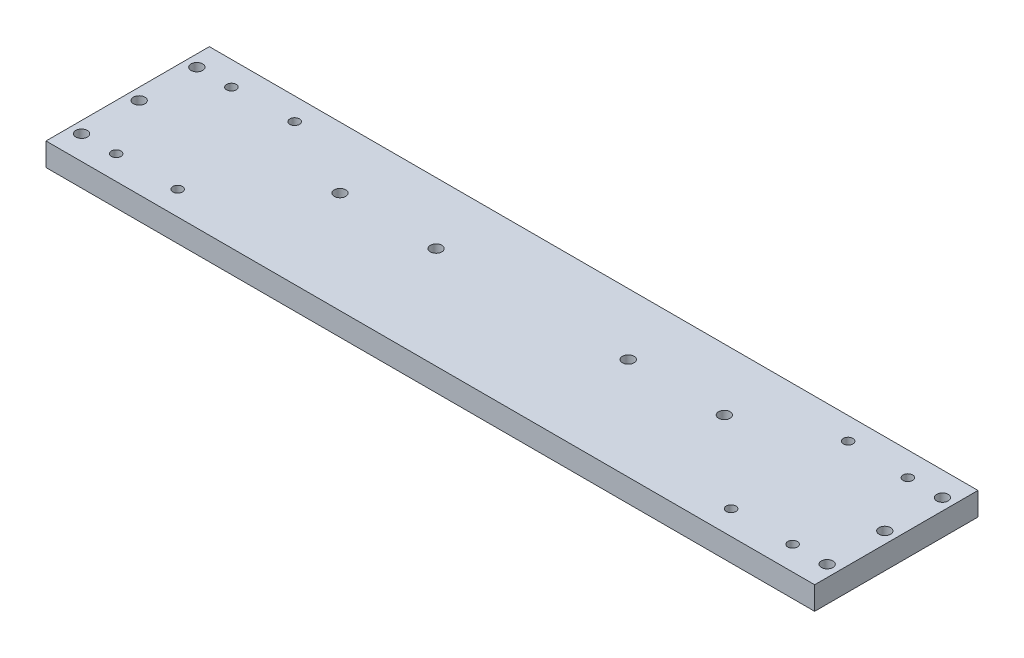
ISO-10303-21;
HEADER;
FILE_DESCRIPTION(('STEP AP214'),'2;1');
FILE_NAME('part.step','',(''),(''),'','','');
FILE_SCHEMA(('AUTOMOTIVE_DESIGN { 1 0 10303 214 1 1 1 1 }'));
ENDSEC;
DATA;
#1=APPLICATION_CONTEXT('core data for automotive mechanical design processes');
#2=APPLICATION_PROTOCOL_DEFINITION('international standard','automotive_design',2000,#1);
#3=PRODUCT_CONTEXT('',#1,'mechanical');
#4=PRODUCT('Part','Part','',(#3));
#5=PRODUCT_RELATED_PRODUCT_CATEGORY('part','',(#4));
#6=PRODUCT_DEFINITION_FORMATION('','',#4);
#7=PRODUCT_DEFINITION_CONTEXT('part definition',#1,'design');
#8=PRODUCT_DEFINITION('design','',#6,#7);
#9=PRODUCT_DEFINITION_SHAPE('','',#8);
#10=(LENGTH_UNIT() NAMED_UNIT(*) SI_UNIT(.MILLI.,.METRE.));
#11=(NAMED_UNIT(*) PLANE_ANGLE_UNIT() SI_UNIT($,.RADIAN.));
#12=(NAMED_UNIT(*) SI_UNIT($,.STERADIAN.) SOLID_ANGLE_UNIT());
#13=UNCERTAINTY_MEASURE_WITH_UNIT(LENGTH_MEASURE(1.E-05),#10,'distance_accuracy_value','');
#14=(GEOMETRIC_REPRESENTATION_CONTEXT(3) GLOBAL_UNCERTAINTY_ASSIGNED_CONTEXT((#13)) GLOBAL_UNIT_ASSIGNED_CONTEXT((#10,
#11,#12)) REPRESENTATION_CONTEXT('',''));
#15=CARTESIAN_POINT('',(0.,0.,0.));
#16=DIRECTION('',(0.,0.,1.));
#17=DIRECTION('',(1.,0.,0.));
#18=AXIS2_PLACEMENT_3D('',#15,#16,#17);
#19=CARTESIAN_POINT('',(200.,12.,-42.5));
#20=DIRECTION('',(0.,-1.,0.));
#21=DIRECTION('',(0.,0.,-1.));
#22=AXIS2_PLACEMENT_3D('',#19,#20,#21);
#23=PLANE('',#22);
#24=CARTESIAN_POINT('',(194.,12.,-30.));
#25=DIRECTION('',(0.,-1.,0.));
#26=DIRECTION('',(0.,0.,1.));
#27=AXIS2_PLACEMENT_3D('',#24,#25,#26);
#28=CIRCLE('',#27,2.99999999999999);
#29=CARTESIAN_POINT('',(194.,12.,-27.));
#30=VERTEX_POINT('',#29);
#31=EDGE_CURVE('E209',#30,#30,#28,.T.);
#32=ORIENTED_EDGE('',*,*,#31,.T.);
#33=EDGE_LOOP('',(#32));
#34=FACE_BOUND('',#33,.T.);
#35=CARTESIAN_POINT('',(176.,12.,-30.));
#36=DIRECTION('',(0.,-1.,0.));
#37=DIRECTION('',(0.,0.,1.));
#38=AXIS2_PLACEMENT_3D('',#35,#36,#37);
#39=CIRCLE('',#38,2.5);
#40=CARTESIAN_POINT('',(176.,12.,-27.5));
#41=VERTEX_POINT('',#40);
#42=EDGE_CURVE('E155',#41,#41,#39,.T.);
#43=ORIENTED_EDGE('',*,*,#42,.T.);
#44=EDGE_LOOP('',(#43));
#45=FACE_BOUND('',#44,.T.);
#46=CARTESIAN_POINT('',(144.,12.,30.));
#47=DIRECTION('',(0.,-1.,0.));
#48=DIRECTION('',(0.,0.,1.));
#49=AXIS2_PLACEMENT_3D('',#46,#47,#48);
#50=CIRCLE('',#49,2.5);
#51=CARTESIAN_POINT('',(144.,12.,32.5));
#52=VERTEX_POINT('',#51);
#53=EDGE_CURVE('E143',#52,#52,#50,.T.);
#54=ORIENTED_EDGE('',*,*,#53,.T.);
#55=EDGE_LOOP('',(#54));
#56=FACE_BOUND('',#55,.T.);
#57=DIRECTION('',(0.,0.,-1.));
#58=VECTOR('',#57,1.);
#59=CARTESIAN_POINT('',(200.,12.,42.5));
#60=LINE('',#59,#58);
#61=CARTESIAN_POINT('',(200.,12.,42.5));
#62=VERTEX_POINT('',#61);
#63=CARTESIAN_POINT('',(200.,12.,-42.5));
#64=VERTEX_POINT('',#63);
#65=EDGE_CURVE('E84',#62,#64,#60,.T.);
#66=ORIENTED_EDGE('',*,*,#65,.T.);
#67=DIRECTION('',(-1.,0.,0.));
#68=VECTOR('',#67,1.);
#69=CARTESIAN_POINT('',(-200.,12.,-42.5));
#70=LINE('',#69,#68);
#71=CARTESIAN_POINT('',(-200.,12.,-42.5));
#72=VERTEX_POINT('',#71);
#73=EDGE_CURVE('E79',#64,#72,#70,.T.);
#74=ORIENTED_EDGE('',*,*,#73,.T.);
#75=DIRECTION('',(0.,0.,1.));
#76=VECTOR('',#75,1.);
#77=CARTESIAN_POINT('',(-200.,12.,42.5));
#78=LINE('',#77,#76);
#79=CARTESIAN_POINT('',(-200.,12.,42.5));
#80=VERTEX_POINT('',#79);
#81=EDGE_CURVE('E82',#72,#80,#78,.T.);
#82=ORIENTED_EDGE('',*,*,#81,.T.);
#83=DIRECTION('',(1.,0.,0.));
#84=VECTOR('',#83,1.);
#85=CARTESIAN_POINT('',(-200.,12.,42.5));
#86=LINE('',#85,#84);
#87=EDGE_CURVE('E49',#80,#62,#86,.T.);
#88=ORIENTED_EDGE('',*,*,#87,.T.);
#89=EDGE_LOOP('',(#66,#74,#82,#88));
#90=FACE_BOUND('',#89,.T.);
#91=CARTESIAN_POINT('',(-176.,12.,30.));
#92=DIRECTION('',(0.,1.,0.));
#93=DIRECTION('',(0.,0.,1.));
#94=AXIS2_PLACEMENT_3D('',#91,#92,#93);
#95=CIRCLE('',#94,2.5);
#96=CARTESIAN_POINT('',(-176.,12.,32.5));
#97=VERTEX_POINT('',#96);
#98=EDGE_CURVE('E99',#97,#97,#95,.T.);
#99=ORIENTED_EDGE('',*,*,#98,.F.);
#100=EDGE_LOOP('',(#99));
#101=FACE_BOUND('',#100,.T.);
#102=CARTESIAN_POINT('',(-144.,12.,30.));
#103=DIRECTION('',(0.,1.,0.));
#104=DIRECTION('',(0.,0.,1.));
#105=AXIS2_PLACEMENT_3D('',#102,#103,#104);
#106=CIRCLE('',#105,2.5);
#107=CARTESIAN_POINT('',(-144.,12.,32.5));
#108=VERTEX_POINT('',#107);
#109=EDGE_CURVE('E114',#108,#108,#106,.T.);
#110=ORIENTED_EDGE('',*,*,#109,.F.);
#111=EDGE_LOOP('',(#110));
#112=FACE_BOUND('',#111,.T.);
#113=CARTESIAN_POINT('',(-144.,12.,-30.918491962409));
#114=DIRECTION('',(0.,1.,0.));
#115=DIRECTION('',(0.,0.,1.));
#116=AXIS2_PLACEMENT_3D('',#113,#114,#115);
#117=CIRCLE('',#116,2.5);
#118=CARTESIAN_POINT('',(-144.,12.,-28.418491962409));
#119=VERTEX_POINT('',#118);
#120=EDGE_CURVE('E120',#119,#119,#117,.T.);
#121=ORIENTED_EDGE('',*,*,#120,.F.);
#122=EDGE_LOOP('',(#121));
#123=FACE_BOUND('',#122,.T.);
#124=CARTESIAN_POINT('',(-176.,12.,-30.));
#125=DIRECTION('',(0.,1.,0.));
#126=DIRECTION('',(0.,0.,1.));
#127=AXIS2_PLACEMENT_3D('',#124,#125,#126);
#128=CIRCLE('',#127,2.5);
#129=CARTESIAN_POINT('',(-176.,12.,-27.5));
#130=VERTEX_POINT('',#129);
#131=EDGE_CURVE('E126',#130,#130,#128,.T.);
#132=ORIENTED_EDGE('',*,*,#131,.F.);
#133=EDGE_LOOP('',(#132));
#134=FACE_BOUND('',#133,.T.);
#135=CARTESIAN_POINT('',(176.,12.,30.));
#136=DIRECTION('',(0.,-1.,0.));
#137=DIRECTION('',(0.,0.,1.));
#138=AXIS2_PLACEMENT_3D('',#135,#136,#137);
#139=CIRCLE('',#138,2.5);
#140=CARTESIAN_POINT('',(176.,12.,32.5));
#141=VERTEX_POINT('',#140);
#142=EDGE_CURVE('E137',#141,#141,#139,.T.);
#143=ORIENTED_EDGE('',*,*,#142,.T.);
#144=EDGE_LOOP('',(#143));
#145=FACE_BOUND('',#144,.T.);
#146=CARTESIAN_POINT('',(144.,12.,-30.918491962409));
#147=DIRECTION('',(0.,-1.,0.));
#148=DIRECTION('',(0.,0.,1.));
#149=AXIS2_PLACEMENT_3D('',#146,#147,#148);
#150=CIRCLE('',#149,2.5);
#151=CARTESIAN_POINT('',(144.,12.,-28.418491962409));
#152=VERTEX_POINT('',#151);
#153=EDGE_CURVE('E149',#152,#152,#150,.T.);
#154=ORIENTED_EDGE('',*,*,#153,.T.);
#155=EDGE_LOOP('',(#154));
#156=FACE_BOUND('',#155,.T.);
#157=CARTESIAN_POINT('',(50.,12.,-10.5));
#158=DIRECTION('',(0.,1.,0.));
#159=DIRECTION('',(0.,0.,1.));
#160=AXIS2_PLACEMENT_3D('',#157,#158,#159);
#161=CIRCLE('',#160,3.);
#162=CARTESIAN_POINT('',(50.,12.,-7.49999999999998));
#163=VERTEX_POINT('',#162);
#164=EDGE_CURVE('E158',#163,#163,#161,.T.);
#165=ORIENTED_EDGE('',*,*,#164,.F.);
#166=EDGE_LOOP('',(#165));
#167=FACE_BOUND('',#166,.T.);
#168=CARTESIAN_POINT('',(100.,12.,-10.5));
#169=DIRECTION('',(0.,1.,0.));
#170=DIRECTION('',(0.,0.,1.));
#171=AXIS2_PLACEMENT_3D('',#168,#169,#170);
#172=CIRCLE('',#171,2.99999999999999);
#173=CARTESIAN_POINT('',(100.,12.,-7.5));
#174=VERTEX_POINT('',#173);
#175=EDGE_CURVE('E162',#174,#174,#172,.T.);
#176=ORIENTED_EDGE('',*,*,#175,.F.);
#177=EDGE_LOOP('',(#176));
#178=FACE_BOUND('',#177,.T.);
#179=CARTESIAN_POINT('',(-100.,12.,-10.5));
#180=DIRECTION('',(0.,1.,0.));
#181=DIRECTION('',(0.,0.,1.));
#182=AXIS2_PLACEMENT_3D('',#179,#180,#181);
#183=CIRCLE('',#182,3.00000000000001);
#184=CARTESIAN_POINT('',(-100.,12.,-7.49999999999996));
#185=VERTEX_POINT('',#184);
#186=EDGE_CURVE('E168',#185,#185,#183,.T.);
#187=ORIENTED_EDGE('',*,*,#186,.F.);
#188=EDGE_LOOP('',(#187));
#189=FACE_BOUND('',#188,.T.);
#190=CARTESIAN_POINT('',(-50.,12.,-10.5));
#191=DIRECTION('',(0.,1.,0.));
#192=DIRECTION('',(0.,0.,1.));
#193=AXIS2_PLACEMENT_3D('',#190,#191,#192);
#194=CIRCLE('',#193,3.);
#195=CARTESIAN_POINT('',(-50.,12.,-7.49999999999997));
#196=VERTEX_POINT('',#195);
#197=EDGE_CURVE('E174',#196,#196,#194,.T.);
#198=ORIENTED_EDGE('',*,*,#197,.F.);
#199=EDGE_LOOP('',(#198));
#200=FACE_BOUND('',#199,.T.);
#201=CARTESIAN_POINT('',(-194.,12.,0.));
#202=DIRECTION('',(0.,1.,0.));
#203=DIRECTION('',(0.,0.,1.));
#204=AXIS2_PLACEMENT_3D('',#201,#202,#203);
#205=CIRCLE('',#204,2.99999999999999);
#206=CARTESIAN_POINT('',(-194.,12.,2.99999999999999));
#207=VERTEX_POINT('',#206);
#208=EDGE_CURVE('E180',#207,#207,#205,.T.);
#209=ORIENTED_EDGE('',*,*,#208,.F.);
#210=EDGE_LOOP('',(#209));
#211=FACE_BOUND('',#210,.T.);
#212=CARTESIAN_POINT('',(-194.,12.,-30.));
#213=DIRECTION('',(0.,1.,0.));
#214=DIRECTION('',(0.,0.,1.));
#215=AXIS2_PLACEMENT_3D('',#212,#213,#214);
#216=CIRCLE('',#215,2.99999999999999);
#217=CARTESIAN_POINT('',(-194.,12.,-27.));
#218=VERTEX_POINT('',#217);
#219=EDGE_CURVE('E186',#218,#218,#216,.T.);
#220=ORIENTED_EDGE('',*,*,#219,.F.);
#221=EDGE_LOOP('',(#220));
#222=FACE_BOUND('',#221,.T.);
#223=CARTESIAN_POINT('',(-194.,12.,30.));
#224=DIRECTION('',(0.,1.,0.));
#225=DIRECTION('',(0.,0.,1.));
#226=AXIS2_PLACEMENT_3D('',#223,#224,#225);
#227=CIRCLE('',#226,2.99999999999999);
#228=CARTESIAN_POINT('',(-194.,12.,33.));
#229=VERTEX_POINT('',#228);
#230=EDGE_CURVE('E192',#229,#229,#227,.T.);
#231=ORIENTED_EDGE('',*,*,#230,.F.);
#232=EDGE_LOOP('',(#231));
#233=FACE_BOUND('',#232,.T.);
#234=CARTESIAN_POINT('',(194.,12.,0.));
#235=DIRECTION('',(0.,-1.,0.));
#236=DIRECTION('',(0.,0.,1.));
#237=AXIS2_PLACEMENT_3D('',#234,#235,#236);
#238=CIRCLE('',#237,2.99999999999999);
#239=CARTESIAN_POINT('',(194.,12.,2.99999999999999));
#240=VERTEX_POINT('',#239);
#241=EDGE_CURVE('E203',#240,#240,#238,.T.);
#242=ORIENTED_EDGE('',*,*,#241,.T.);
#243=EDGE_LOOP('',(#242));
#244=FACE_BOUND('',#243,.T.);
#245=CARTESIAN_POINT('',(194.,12.,30.));
#246=DIRECTION('',(0.,-1.,0.));
#247=DIRECTION('',(0.,0.,1.));
#248=AXIS2_PLACEMENT_3D('',#245,#246,#247);
#249=CIRCLE('',#248,2.99999999999999);
#250=CARTESIAN_POINT('',(194.,12.,33.));
#251=VERTEX_POINT('',#250);
#252=EDGE_CURVE('E215',#251,#251,#249,.T.);
#253=ORIENTED_EDGE('',*,*,#252,.T.);
#254=EDGE_LOOP('',(#253));
#255=FACE_BOUND('',#254,.T.);
#256=ADVANCED_FACE('F32',(#34,#45,#56,#90,#101,#112,#123,#134,#145,#156,#167,#178,#189,#200,
#211,#222,#233,#244,#255),#23,.F.);
#257=CARTESIAN_POINT('',(200.,0.,-42.5));
#258=DIRECTION('',(0.,-1.,0.));
#259=DIRECTION('',(0.,0.,-1.));
#260=AXIS2_PLACEMENT_3D('',#257,#258,#259);
#261=PLANE('',#260);
#262=CARTESIAN_POINT('',(194.,0.,-30.));
#263=DIRECTION('',(0.,-1.,0.));
#264=DIRECTION('',(0.,0.,-1.));
#265=AXIS2_PLACEMENT_3D('',#262,#263,#264);
#266=CIRCLE('',#265,2.99999999999999);
#267=CARTESIAN_POINT('',(194.,0.,-33.));
#268=VERTEX_POINT('',#267);
#269=EDGE_CURVE('E206',#268,#268,#266,.T.);
#270=ORIENTED_EDGE('',*,*,#269,.F.);
#271=EDGE_LOOP('',(#270));
#272=FACE_BOUND('',#271,.T.);
#273=CARTESIAN_POINT('',(176.,0.,-30.));
#274=DIRECTION('',(0.,-1.,0.));
#275=DIRECTION('',(0.,0.,-1.));
#276=AXIS2_PLACEMENT_3D('',#273,#274,#275);
#277=CIRCLE('',#276,2.5);
#278=CARTESIAN_POINT('',(176.,0.,-32.5));
#279=VERTEX_POINT('',#278);
#280=EDGE_CURVE('E152',#279,#279,#277,.T.);
#281=ORIENTED_EDGE('',*,*,#280,.F.);
#282=EDGE_LOOP('',(#281));
#283=FACE_BOUND('',#282,.T.);
#284=CARTESIAN_POINT('',(144.,0.,30.));
#285=DIRECTION('',(0.,-1.,0.));
#286=DIRECTION('',(0.,0.,-1.));
#287=AXIS2_PLACEMENT_3D('',#284,#285,#286);
#288=CIRCLE('',#287,2.5);
#289=CARTESIAN_POINT('',(144.,0.,27.5));
#290=VERTEX_POINT('',#289);
#291=EDGE_CURVE('E140',#290,#290,#288,.T.);
#292=ORIENTED_EDGE('',*,*,#291,.F.);
#293=EDGE_LOOP('',(#292));
#294=FACE_BOUND('',#293,.T.);
#295=DIRECTION('',(0.,0.,-1.));
#296=VECTOR('',#295,1.);
#297=CARTESIAN_POINT('',(200.,0.,42.5));
#298=LINE('',#297,#296);
#299=CARTESIAN_POINT('',(200.,0.,42.5));
#300=VERTEX_POINT('',#299);
#301=CARTESIAN_POINT('',(200.,0.,-42.5));
#302=VERTEX_POINT('',#301);
#303=EDGE_CURVE('E96',#300,#302,#298,.T.);
#304=ORIENTED_EDGE('',*,*,#303,.F.);
#305=DIRECTION('',(1.,0.,0.));
#306=VECTOR('',#305,1.);
#307=CARTESIAN_POINT('',(-200.,0.,42.5));
#308=LINE('',#307,#306);
#309=CARTESIAN_POINT('',(-200.,0.,42.5));
#310=VERTEX_POINT('',#309);
#311=EDGE_CURVE('E72',#310,#300,#308,.T.);
#312=ORIENTED_EDGE('',*,*,#311,.F.);
#313=DIRECTION('',(0.,0.,1.));
#314=VECTOR('',#313,1.);
#315=CARTESIAN_POINT('',(-200.,0.,42.5));
#316=LINE('',#315,#314);
#317=CARTESIAN_POINT('',(-200.,0.,-42.5));
#318=VERTEX_POINT('',#317);
#319=EDGE_CURVE('E66',#318,#310,#316,.T.);
#320=ORIENTED_EDGE('',*,*,#319,.F.);
#321=DIRECTION('',(-1.,0.,0.));
#322=VECTOR('',#321,1.);
#323=CARTESIAN_POINT('',(-200.,0.,-42.5));
#324=LINE('',#323,#322);
#325=EDGE_CURVE('E88',#302,#318,#324,.T.);
#326=ORIENTED_EDGE('',*,*,#325,.F.);
#327=EDGE_LOOP('',(#304,#312,#320,#326));
#328=FACE_BOUND('',#327,.T.);
#329=CARTESIAN_POINT('',(-176.,0.,30.));
#330=DIRECTION('',(0.,-1.,0.));
#331=DIRECTION('',(0.,0.,-1.));
#332=AXIS2_PLACEMENT_3D('',#329,#330,#331);
#333=CIRCLE('',#332,2.5);
#334=CARTESIAN_POINT('',(-176.,0.,27.5));
#335=VERTEX_POINT('',#334);
#336=EDGE_CURVE('E111',#335,#335,#333,.F.);
#337=ORIENTED_EDGE('',*,*,#336,.T.);
#338=EDGE_LOOP('',(#337));
#339=FACE_BOUND('',#338,.T.);
#340=CARTESIAN_POINT('',(-144.,0.,30.));
#341=DIRECTION('',(0.,-1.,0.));
#342=DIRECTION('',(0.,0.,-1.));
#343=AXIS2_PLACEMENT_3D('',#340,#341,#342);
#344=CIRCLE('',#343,2.5);
#345=CARTESIAN_POINT('',(-144.,0.,27.5));
#346=VERTEX_POINT('',#345);
#347=EDGE_CURVE('E117',#346,#346,#344,.F.);
#348=ORIENTED_EDGE('',*,*,#347,.T.);
#349=EDGE_LOOP('',(#348));
#350=FACE_BOUND('',#349,.T.);
#351=CARTESIAN_POINT('',(-144.,0.,-30.918491962409));
#352=DIRECTION('',(0.,-1.,0.));
#353=DIRECTION('',(0.,0.,-1.));
#354=AXIS2_PLACEMENT_3D('',#351,#352,#353);
#355=CIRCLE('',#354,2.5);
#356=CARTESIAN_POINT('',(-144.,0.,-33.418491962409));
#357=VERTEX_POINT('',#356);
#358=EDGE_CURVE('E123',#357,#357,#355,.F.);
#359=ORIENTED_EDGE('',*,*,#358,.T.);
#360=EDGE_LOOP('',(#359));
#361=FACE_BOUND('',#360,.T.);
#362=CARTESIAN_POINT('',(-176.,0.,-30.));
#363=DIRECTION('',(0.,-1.,0.));
#364=DIRECTION('',(0.,0.,-1.));
#365=AXIS2_PLACEMENT_3D('',#362,#363,#364);
#366=CIRCLE('',#365,2.5);
#367=CARTESIAN_POINT('',(-176.,0.,-32.5));
#368=VERTEX_POINT('',#367);
#369=EDGE_CURVE('E129',#368,#368,#366,.F.);
#370=ORIENTED_EDGE('',*,*,#369,.T.);
#371=EDGE_LOOP('',(#370));
#372=FACE_BOUND('',#371,.T.);
#373=CARTESIAN_POINT('',(176.,0.,30.));
#374=DIRECTION('',(0.,-1.,0.));
#375=DIRECTION('',(0.,0.,-1.));
#376=AXIS2_PLACEMENT_3D('',#373,#374,#375);
#377=CIRCLE('',#376,2.5);
#378=CARTESIAN_POINT('',(176.,0.,27.5));
#379=VERTEX_POINT('',#378);
#380=EDGE_CURVE('E132',#379,#379,#377,.T.);
#381=ORIENTED_EDGE('',*,*,#380,.F.);
#382=EDGE_LOOP('',(#381));
#383=FACE_BOUND('',#382,.T.);
#384=CARTESIAN_POINT('',(144.,0.,-30.918491962409));
#385=DIRECTION('',(0.,-1.,0.));
#386=DIRECTION('',(0.,0.,-1.));
#387=AXIS2_PLACEMENT_3D('',#384,#385,#386);
#388=CIRCLE('',#387,2.5);
#389=CARTESIAN_POINT('',(144.,0.,-33.418491962409));
#390=VERTEX_POINT('',#389);
#391=EDGE_CURVE('E146',#390,#390,#388,.T.);
#392=ORIENTED_EDGE('',*,*,#391,.F.);
#393=EDGE_LOOP('',(#392));
#394=FACE_BOUND('',#393,.T.);
#395=CARTESIAN_POINT('',(50.,0.,-10.5));
#396=DIRECTION('',(0.,-1.,0.));
#397=DIRECTION('',(0.,0.,-1.));
#398=AXIS2_PLACEMENT_3D('',#395,#396,#397);
#399=CIRCLE('',#398,3.);
#400=CARTESIAN_POINT('',(50.,0.,-13.5));
#401=VERTEX_POINT('',#400);
#402=EDGE_CURVE('E159',#401,#401,#399,.F.);
#403=ORIENTED_EDGE('',*,*,#402,.T.);
#404=EDGE_LOOP('',(#403));
#405=FACE_BOUND('',#404,.T.);
#406=CARTESIAN_POINT('',(100.,0.,-10.5));
#407=DIRECTION('',(0.,-1.,0.));
#408=DIRECTION('',(0.,0.,-1.));
#409=AXIS2_PLACEMENT_3D('',#406,#407,#408);
#410=CIRCLE('',#409,2.99999999999999);
#411=CARTESIAN_POINT('',(100.,0.,-13.5));
#412=VERTEX_POINT('',#411);
#413=EDGE_CURVE('E165',#412,#412,#410,.F.);
#414=ORIENTED_EDGE('',*,*,#413,.T.);
#415=EDGE_LOOP('',(#414));
#416=FACE_BOUND('',#415,.T.);
#417=CARTESIAN_POINT('',(-100.,0.,-10.5));
#418=DIRECTION('',(0.,-1.,0.));
#419=DIRECTION('',(0.,0.,-1.));
#420=AXIS2_PLACEMENT_3D('',#417,#418,#419);
#421=CIRCLE('',#420,3.00000000000001);
#422=CARTESIAN_POINT('',(-100.,0.,-13.5));
#423=VERTEX_POINT('',#422);
#424=EDGE_CURVE('E171',#423,#423,#421,.F.);
#425=ORIENTED_EDGE('',*,*,#424,.T.);
#426=EDGE_LOOP('',(#425));
#427=FACE_BOUND('',#426,.T.);
#428=CARTESIAN_POINT('',(-50.,0.,-10.5));
#429=DIRECTION('',(0.,-1.,0.));
#430=DIRECTION('',(0.,0.,-1.));
#431=AXIS2_PLACEMENT_3D('',#428,#429,#430);
#432=CIRCLE('',#431,3.);
#433=CARTESIAN_POINT('',(-50.,0.,-13.5));
#434=VERTEX_POINT('',#433);
#435=EDGE_CURVE('E177',#434,#434,#432,.F.);
#436=ORIENTED_EDGE('',*,*,#435,.T.);
#437=EDGE_LOOP('',(#436));
#438=FACE_BOUND('',#437,.T.);
#439=CARTESIAN_POINT('',(-194.,0.,0.));
#440=DIRECTION('',(0.,-1.,0.));
#441=DIRECTION('',(0.,0.,-1.));
#442=AXIS2_PLACEMENT_3D('',#439,#440,#441);
#443=CIRCLE('',#442,2.99999999999999);
#444=CARTESIAN_POINT('',(-194.,0.,-2.99999999999999));
#445=VERTEX_POINT('',#444);
#446=EDGE_CURVE('E183',#445,#445,#443,.F.);
#447=ORIENTED_EDGE('',*,*,#446,.T.);
#448=EDGE_LOOP('',(#447));
#449=FACE_BOUND('',#448,.T.);
#450=CARTESIAN_POINT('',(-194.,0.,-30.));
#451=DIRECTION('',(0.,-1.,0.));
#452=DIRECTION('',(0.,0.,-1.));
#453=AXIS2_PLACEMENT_3D('',#450,#451,#452);
#454=CIRCLE('',#453,2.99999999999999);
#455=CARTESIAN_POINT('',(-194.,0.,-33.));
#456=VERTEX_POINT('',#455);
#457=EDGE_CURVE('E189',#456,#456,#454,.F.);
#458=ORIENTED_EDGE('',*,*,#457,.T.);
#459=EDGE_LOOP('',(#458));
#460=FACE_BOUND('',#459,.T.);
#461=CARTESIAN_POINT('',(-194.,0.,30.));
#462=DIRECTION('',(0.,-1.,0.));
#463=DIRECTION('',(0.,0.,-1.));
#464=AXIS2_PLACEMENT_3D('',#461,#462,#463);
#465=CIRCLE('',#464,2.99999999999999);
#466=CARTESIAN_POINT('',(-194.,0.,27.));
#467=VERTEX_POINT('',#466);
#468=EDGE_CURVE('E195',#467,#467,#465,.F.);
#469=ORIENTED_EDGE('',*,*,#468,.T.);
#470=EDGE_LOOP('',(#469));
#471=FACE_BOUND('',#470,.T.);
#472=CARTESIAN_POINT('',(194.,0.,0.));
#473=DIRECTION('',(0.,-1.,0.));
#474=DIRECTION('',(0.,0.,-1.));
#475=AXIS2_PLACEMENT_3D('',#472,#473,#474);
#476=CIRCLE('',#475,2.99999999999999);
#477=CARTESIAN_POINT('',(194.,0.,-2.99999999999999));
#478=VERTEX_POINT('',#477);
#479=EDGE_CURVE('E198',#478,#478,#476,.T.);
#480=ORIENTED_EDGE('',*,*,#479,.F.);
#481=EDGE_LOOP('',(#480));
#482=FACE_BOUND('',#481,.T.);
#483=CARTESIAN_POINT('',(194.,0.,30.));
#484=DIRECTION('',(0.,-1.,0.));
#485=DIRECTION('',(0.,0.,-1.));
#486=AXIS2_PLACEMENT_3D('',#483,#484,#485);
#487=CIRCLE('',#486,2.99999999999999);
#488=CARTESIAN_POINT('',(194.,0.,27.));
#489=VERTEX_POINT('',#488);
#490=EDGE_CURVE('E212',#489,#489,#487,.T.);
#491=ORIENTED_EDGE('',*,*,#490,.F.);
#492=EDGE_LOOP('',(#491));
#493=FACE_BOUND('',#492,.T.);
#494=ADVANCED_FACE('F107',(#272,#283,#294,#328,#339,#350,#361,#372,#383,#394,#405,#416,#427,
#438,#449,#460,#471,#482,#493),#261,.T.);
#495=CARTESIAN_POINT('',(200.,12.,42.5));
#496=DIRECTION('',(-1.,0.,0.));
#497=DIRECTION('',(0.,0.,1.));
#498=AXIS2_PLACEMENT_3D('',#495,#496,#497);
#499=PLANE('',#498);
#500=ORIENTED_EDGE('',*,*,#303,.T.);
#501=DIRECTION('',(0.,-1.,0.));
#502=VECTOR('',#501,1.);
#503=CARTESIAN_POINT('',(200.,12.,-42.5));
#504=LINE('',#503,#502);
#505=EDGE_CURVE('E11',#64,#302,#504,.T.);
#506=ORIENTED_EDGE('',*,*,#505,.F.);
#507=ORIENTED_EDGE('',*,*,#65,.F.);
#508=DIRECTION('',(0.,-1.,0.));
#509=VECTOR('',#508,1.);
#510=CARTESIAN_POINT('',(200.,12.,42.5));
#511=LINE('',#510,#509);
#512=EDGE_CURVE('E92',#62,#300,#511,.T.);
#513=ORIENTED_EDGE('',*,*,#512,.T.);
#514=EDGE_LOOP('',(#500,#506,#507,#513));
#515=FACE_BOUND('',#514,.T.);
#516=ADVANCED_FACE('F34',(#515),#499,.F.);
#517=CARTESIAN_POINT('',(-200.,12.,-42.5));
#518=DIRECTION('',(0.,0.,1.));
#519=DIRECTION('',(1.,0.,0.));
#520=AXIS2_PLACEMENT_3D('',#517,#518,#519);
#521=PLANE('',#520);
#522=ORIENTED_EDGE('',*,*,#325,.T.);
#523=DIRECTION('',(0.,-1.,0.));
#524=VECTOR('',#523,1.);
#525=CARTESIAN_POINT('',(-200.,12.,-42.5));
#526=LINE('',#525,#524);
#527=EDGE_CURVE('E41',#72,#318,#526,.T.);
#528=ORIENTED_EDGE('',*,*,#527,.F.);
#529=ORIENTED_EDGE('',*,*,#73,.F.);
#530=ORIENTED_EDGE('',*,*,#505,.T.);
#531=EDGE_LOOP('',(#522,#528,#529,#530));
#532=FACE_BOUND('',#531,.T.);
#533=ADVANCED_FACE('F87',(#532),#521,.F.);
#534=CARTESIAN_POINT('',(-200.,12.,42.5));
#535=DIRECTION('',(1.,0.,0.));
#536=DIRECTION('',(0.,0.,-1.));
#537=AXIS2_PLACEMENT_3D('',#534,#535,#536);
#538=PLANE('',#537);
#539=ORIENTED_EDGE('',*,*,#319,.T.);
#540=DIRECTION('',(0.,-1.,0.));
#541=VECTOR('',#540,1.);
#542=CARTESIAN_POINT('',(-200.,12.,42.5));
#543=LINE('',#542,#541);
#544=EDGE_CURVE('E89',#80,#310,#543,.T.);
#545=ORIENTED_EDGE('',*,*,#544,.F.);
#546=ORIENTED_EDGE('',*,*,#81,.F.);
#547=ORIENTED_EDGE('',*,*,#527,.T.);
#548=EDGE_LOOP('',(#539,#545,#546,#547));
#549=FACE_BOUND('',#548,.T.);
#550=ADVANCED_FACE('F90',(#549),#538,.F.);
#551=CARTESIAN_POINT('',(-200.,12.,42.5));
#552=DIRECTION('',(0.,0.,-1.));
#553=DIRECTION('',(-1.,0.,0.));
#554=AXIS2_PLACEMENT_3D('',#551,#552,#553);
#555=PLANE('',#554);
#556=ORIENTED_EDGE('',*,*,#311,.T.);
#557=ORIENTED_EDGE('',*,*,#512,.F.);
#558=ORIENTED_EDGE('',*,*,#87,.F.);
#559=ORIENTED_EDGE('',*,*,#544,.T.);
#560=EDGE_LOOP('',(#556,#557,#558,#559));
#561=FACE_BOUND('',#560,.T.);
#562=ADVANCED_FACE('F104',(#561),#555,.F.);
#563=CARTESIAN_POINT('',(-176.,-0.000999999999999265,30.));
#564=DIRECTION('',(0.,1.,0.));
#565=DIRECTION('',(0.,0.,1.));
#566=AXIS2_PLACEMENT_3D('',#563,#564,#565);
#567=CYLINDRICAL_SURFACE('',#566,2.5);
#568=ORIENTED_EDGE('',*,*,#336,.F.);
#569=EDGE_LOOP('',(#568));
#570=FACE_BOUND('',#569,.T.);
#571=ORIENTED_EDGE('',*,*,#98,.T.);
#572=EDGE_LOOP('',(#571));
#573=FACE_BOUND('',#572,.T.);
#574=ADVANCED_FACE('F241',(#570,#573),#567,.F.);
#575=CARTESIAN_POINT('',(-144.,-0.000999999999999265,30.));
#576=DIRECTION('',(0.,1.,0.));
#577=DIRECTION('',(0.,0.,1.));
#578=AXIS2_PLACEMENT_3D('',#575,#576,#577);
#579=CYLINDRICAL_SURFACE('',#578,2.5);
#580=ORIENTED_EDGE('',*,*,#347,.F.);
#581=EDGE_LOOP('',(#580));
#582=FACE_BOUND('',#581,.T.);
#583=ORIENTED_EDGE('',*,*,#109,.T.);
#584=EDGE_LOOP('',(#583));
#585=FACE_BOUND('',#584,.T.);
#586=ADVANCED_FACE('F383',(#582,#585),#579,.F.);
#587=CARTESIAN_POINT('',(-144.,-0.000999999999999265,-30.918491962409));
#588=DIRECTION('',(0.,1.,0.));
#589=DIRECTION('',(0.,0.,1.));
#590=AXIS2_PLACEMENT_3D('',#587,#588,#589);
#591=CYLINDRICAL_SURFACE('',#590,2.5);
#592=ORIENTED_EDGE('',*,*,#358,.F.);
#593=EDGE_LOOP('',(#592));
#594=FACE_BOUND('',#593,.T.);
#595=ORIENTED_EDGE('',*,*,#120,.T.);
#596=EDGE_LOOP('',(#595));
#597=FACE_BOUND('',#596,.T.);
#598=ADVANCED_FACE('F375',(#594,#597),#591,.F.);
#599=CARTESIAN_POINT('',(-176.,-0.000999999999999265,-30.));
#600=DIRECTION('',(0.,1.,0.));
#601=DIRECTION('',(0.,0.,1.));
#602=AXIS2_PLACEMENT_3D('',#599,#600,#601);
#603=CYLINDRICAL_SURFACE('',#602,2.5);
#604=ORIENTED_EDGE('',*,*,#369,.F.);
#605=EDGE_LOOP('',(#604));
#606=FACE_BOUND('',#605,.T.);
#607=ORIENTED_EDGE('',*,*,#131,.T.);
#608=EDGE_LOOP('',(#607));
#609=FACE_BOUND('',#608,.T.);
#610=ADVANCED_FACE('F367',(#606,#609),#603,.F.);
#611=CARTESIAN_POINT('',(176.,-0.000999999999999265,30.));
#612=DIRECTION('',(0.,1.,0.));
#613=DIRECTION('',(0.,0.,1.));
#614=AXIS2_PLACEMENT_3D('',#611,#612,#613);
#615=CYLINDRICAL_SURFACE('',#614,2.5);
#616=ORIENTED_EDGE('',*,*,#380,.T.);
#617=EDGE_LOOP('',(#616));
#618=FACE_BOUND('',#617,.T.);
#619=ORIENTED_EDGE('',*,*,#142,.F.);
#620=EDGE_LOOP('',(#619));
#621=FACE_BOUND('',#620,.T.);
#622=ADVANCED_FACE('F359',(#618,#621),#615,.F.);
#623=CARTESIAN_POINT('',(144.,-0.000999999999999265,30.));
#624=DIRECTION('',(0.,1.,0.));
#625=DIRECTION('',(0.,0.,1.));
#626=AXIS2_PLACEMENT_3D('',#623,#624,#625);
#627=CYLINDRICAL_SURFACE('',#626,2.5);
#628=ORIENTED_EDGE('',*,*,#291,.T.);
#629=EDGE_LOOP('',(#628));
#630=FACE_BOUND('',#629,.T.);
#631=ORIENTED_EDGE('',*,*,#53,.F.);
#632=EDGE_LOOP('',(#631));
#633=FACE_BOUND('',#632,.T.);
#634=ADVANCED_FACE('F351',(#630,#633),#627,.F.);
#635=CARTESIAN_POINT('',(144.,-0.000999999999999265,-30.918491962409));
#636=DIRECTION('',(0.,1.,0.));
#637=DIRECTION('',(0.,0.,1.));
#638=AXIS2_PLACEMENT_3D('',#635,#636,#637);
#639=CYLINDRICAL_SURFACE('',#638,2.5);
#640=ORIENTED_EDGE('',*,*,#391,.T.);
#641=EDGE_LOOP('',(#640));
#642=FACE_BOUND('',#641,.T.);
#643=ORIENTED_EDGE('',*,*,#153,.F.);
#644=EDGE_LOOP('',(#643));
#645=FACE_BOUND('',#644,.T.);
#646=ADVANCED_FACE('F343',(#642,#645),#639,.F.);
#647=CARTESIAN_POINT('',(176.,-0.000999999999999265,-30.));
#648=DIRECTION('',(0.,1.,0.));
#649=DIRECTION('',(0.,0.,1.));
#650=AXIS2_PLACEMENT_3D('',#647,#648,#649);
#651=CYLINDRICAL_SURFACE('',#650,2.5);
#652=ORIENTED_EDGE('',*,*,#280,.T.);
#653=EDGE_LOOP('',(#652));
#654=FACE_BOUND('',#653,.T.);
#655=ORIENTED_EDGE('',*,*,#42,.F.);
#656=EDGE_LOOP('',(#655));
#657=FACE_BOUND('',#656,.T.);
#658=ADVANCED_FACE('F335',(#654,#657),#651,.F.);
#659=CARTESIAN_POINT('',(50.,-0.000999999999999265,-10.5));
#660=DIRECTION('',(0.,1.,0.));
#661=DIRECTION('',(0.,0.,1.));
#662=AXIS2_PLACEMENT_3D('',#659,#660,#661);
#663=CYLINDRICAL_SURFACE('',#662,3.);
#664=ORIENTED_EDGE('',*,*,#402,.F.);
#665=EDGE_LOOP('',(#664));
#666=FACE_BOUND('',#665,.T.);
#667=ORIENTED_EDGE('',*,*,#164,.T.);
#668=EDGE_LOOP('',(#667));
#669=FACE_BOUND('',#668,.T.);
#670=ADVANCED_FACE('F327',(#666,#669),#663,.F.);
#671=CARTESIAN_POINT('',(100.,-0.000999999999999265,-10.5));
#672=DIRECTION('',(0.,1.,0.));
#673=DIRECTION('',(0.,0.,1.));
#674=AXIS2_PLACEMENT_3D('',#671,#672,#673);
#675=CYLINDRICAL_SURFACE('',#674,2.99999999999999);
#676=ORIENTED_EDGE('',*,*,#413,.F.);
#677=EDGE_LOOP('',(#676));
#678=FACE_BOUND('',#677,.T.);
#679=ORIENTED_EDGE('',*,*,#175,.T.);
#680=EDGE_LOOP('',(#679));
#681=FACE_BOUND('',#680,.T.);
#682=ADVANCED_FACE('F319',(#678,#681),#675,.F.);
#683=CARTESIAN_POINT('',(-100.,-0.000999999999999265,-10.5));
#684=DIRECTION('',(0.,1.,0.));
#685=DIRECTION('',(0.,0.,1.));
#686=AXIS2_PLACEMENT_3D('',#683,#684,#685);
#687=CYLINDRICAL_SURFACE('',#686,3.00000000000001);
#688=ORIENTED_EDGE('',*,*,#424,.F.);
#689=EDGE_LOOP('',(#688));
#690=FACE_BOUND('',#689,.T.);
#691=ORIENTED_EDGE('',*,*,#186,.T.);
#692=EDGE_LOOP('',(#691));
#693=FACE_BOUND('',#692,.T.);
#694=ADVANCED_FACE('F311',(#690,#693),#687,.F.);
#695=CARTESIAN_POINT('',(-50.,-0.000999999999999265,-10.5));
#696=DIRECTION('',(0.,1.,0.));
#697=DIRECTION('',(0.,0.,1.));
#698=AXIS2_PLACEMENT_3D('',#695,#696,#697);
#699=CYLINDRICAL_SURFACE('',#698,3.);
#700=ORIENTED_EDGE('',*,*,#435,.F.);
#701=EDGE_LOOP('',(#700));
#702=FACE_BOUND('',#701,.T.);
#703=ORIENTED_EDGE('',*,*,#197,.T.);
#704=EDGE_LOOP('',(#703));
#705=FACE_BOUND('',#704,.T.);
#706=ADVANCED_FACE('F303',(#702,#705),#699,.F.);
#707=CARTESIAN_POINT('',(-194.,-0.000999999999999265,0.));
#708=DIRECTION('',(0.,1.,0.));
#709=DIRECTION('',(0.,0.,1.));
#710=AXIS2_PLACEMENT_3D('',#707,#708,#709);
#711=CYLINDRICAL_SURFACE('',#710,2.99999999999999);
#712=ORIENTED_EDGE('',*,*,#446,.F.);
#713=EDGE_LOOP('',(#712));
#714=FACE_BOUND('',#713,.T.);
#715=ORIENTED_EDGE('',*,*,#208,.T.);
#716=EDGE_LOOP('',(#715));
#717=FACE_BOUND('',#716,.T.);
#718=ADVANCED_FACE('F295',(#714,#717),#711,.F.);
#719=CARTESIAN_POINT('',(-194.,-0.000999999999999265,-30.));
#720=DIRECTION('',(0.,1.,0.));
#721=DIRECTION('',(0.,0.,1.));
#722=AXIS2_PLACEMENT_3D('',#719,#720,#721);
#723=CYLINDRICAL_SURFACE('',#722,2.99999999999999);
#724=ORIENTED_EDGE('',*,*,#457,.F.);
#725=EDGE_LOOP('',(#724));
#726=FACE_BOUND('',#725,.T.);
#727=ORIENTED_EDGE('',*,*,#219,.T.);
#728=EDGE_LOOP('',(#727));
#729=FACE_BOUND('',#728,.T.);
#730=ADVANCED_FACE('F288',(#726,#729),#723,.F.);
#731=CARTESIAN_POINT('',(-194.,-0.000999999999999265,30.));
#732=DIRECTION('',(0.,1.,0.));
#733=DIRECTION('',(0.,0.,1.));
#734=AXIS2_PLACEMENT_3D('',#731,#732,#733);
#735=CYLINDRICAL_SURFACE('',#734,2.99999999999999);
#736=ORIENTED_EDGE('',*,*,#468,.F.);
#737=EDGE_LOOP('',(#736));
#738=FACE_BOUND('',#737,.T.);
#739=ORIENTED_EDGE('',*,*,#230,.T.);
#740=EDGE_LOOP('',(#739));
#741=FACE_BOUND('',#740,.T.);
#742=ADVANCED_FACE('F270',(#738,#741),#735,.F.);
#743=CARTESIAN_POINT('',(194.,-0.000999999999999265,0.));
#744=DIRECTION('',(0.,1.,0.));
#745=DIRECTION('',(0.,0.,1.));
#746=AXIS2_PLACEMENT_3D('',#743,#744,#745);
#747=CYLINDRICAL_SURFACE('',#746,2.99999999999999);
#748=ORIENTED_EDGE('',*,*,#479,.T.);
#749=EDGE_LOOP('',(#748));
#750=FACE_BOUND('',#749,.T.);
#751=ORIENTED_EDGE('',*,*,#241,.F.);
#752=EDGE_LOOP('',(#751));
#753=FACE_BOUND('',#752,.T.);
#754=ADVANCED_FACE('F228',(#750,#753),#747,.F.);
#755=CARTESIAN_POINT('',(194.,-0.000999999999999265,-30.));
#756=DIRECTION('',(0.,1.,0.));
#757=DIRECTION('',(0.,0.,1.));
#758=AXIS2_PLACEMENT_3D('',#755,#756,#757);
#759=CYLINDRICAL_SURFACE('',#758,2.99999999999999);
#760=ORIENTED_EDGE('',*,*,#269,.T.);
#761=EDGE_LOOP('',(#760));
#762=FACE_BOUND('',#761,.T.);
#763=ORIENTED_EDGE('',*,*,#31,.F.);
#764=EDGE_LOOP('',(#763));
#765=FACE_BOUND('',#764,.T.);
#766=ADVANCED_FACE('F222',(#762,#765),#759,.F.);
#767=CARTESIAN_POINT('',(194.,-0.000999999999999265,30.));
#768=DIRECTION('',(0.,1.,0.));
#769=DIRECTION('',(0.,0.,1.));
#770=AXIS2_PLACEMENT_3D('',#767,#768,#769);
#771=CYLINDRICAL_SURFACE('',#770,2.99999999999999);
#772=ORIENTED_EDGE('',*,*,#490,.T.);
#773=EDGE_LOOP('',(#772));
#774=FACE_BOUND('',#773,.T.);
#775=ORIENTED_EDGE('',*,*,#252,.F.);
#776=EDGE_LOOP('',(#775));
#777=FACE_BOUND('',#776,.T.);
#778=ADVANCED_FACE('F220',(#774,#777),#771,.F.);
#779=CLOSED_SHELL('',(#256,#494,#516,#533,#550,#562,#574,#586,#598,#610,#622,#634,#646,#658,
#670,#682,#694,#706,#718,#730,#742,#754,#766,#778));
#780=MANIFOLD_SOLID_BREP('B2',#779);
#781=ADVANCED_BREP_SHAPE_REPRESENTATION('',(#18,#780),#14);
#782=SHAPE_DEFINITION_REPRESENTATION(#9,#781);
ENDSEC;
END-ISO-10303-21;
